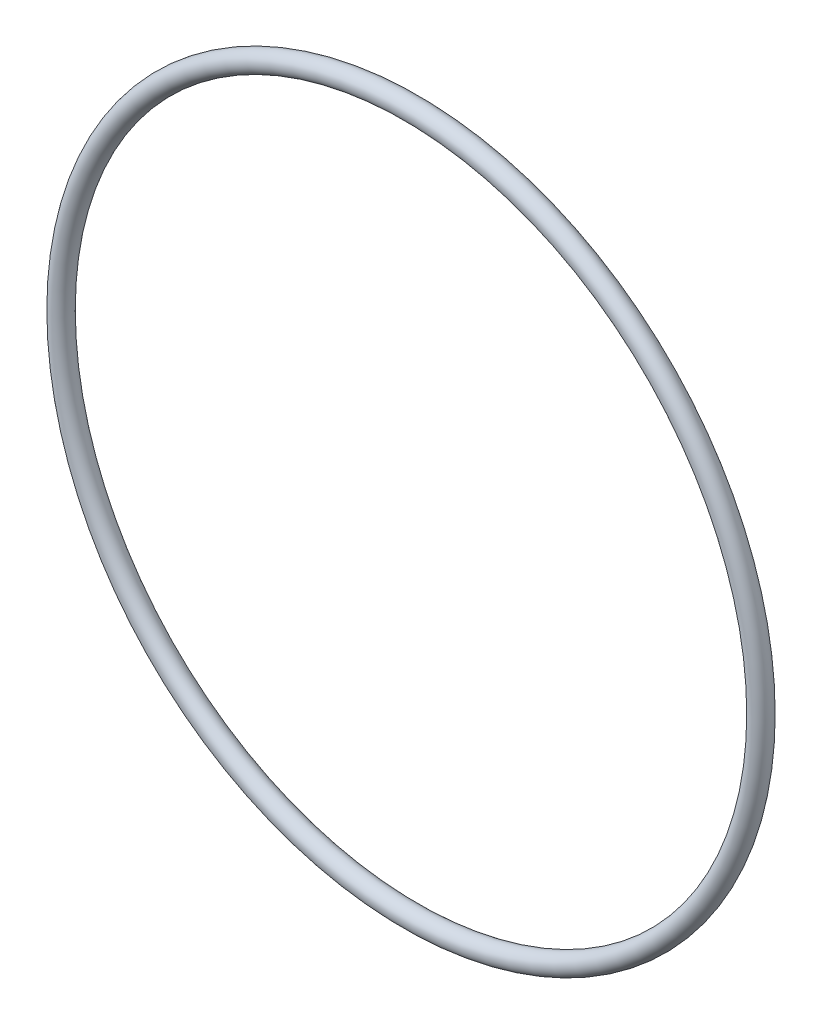
ISO-10303-21;
HEADER;
FILE_DESCRIPTION(('STEP AP214'),'2;1');
FILE_NAME('part.step','',(''),(''),'','','');
FILE_SCHEMA(('AUTOMOTIVE_DESIGN { 1 0 10303 214 1 1 1 1 }'));
ENDSEC;
DATA;
#1=APPLICATION_CONTEXT('core data for automotive mechanical design processes');
#2=APPLICATION_PROTOCOL_DEFINITION('international standard','automotive_design',2000,#1);
#3=PRODUCT_CONTEXT('',#1,'mechanical');
#4=PRODUCT('Part','Part','',(#3));
#5=PRODUCT_RELATED_PRODUCT_CATEGORY('part','',(#4));
#6=PRODUCT_DEFINITION_FORMATION('','',#4);
#7=PRODUCT_DEFINITION_CONTEXT('part definition',#1,'design');
#8=PRODUCT_DEFINITION('design','',#6,#7);
#9=PRODUCT_DEFINITION_SHAPE('','',#8);
#10=(LENGTH_UNIT() NAMED_UNIT(*) SI_UNIT(.MILLI.,.METRE.));
#11=(NAMED_UNIT(*) PLANE_ANGLE_UNIT() SI_UNIT($,.RADIAN.));
#12=(NAMED_UNIT(*) SI_UNIT($,.STERADIAN.) SOLID_ANGLE_UNIT());
#13=UNCERTAINTY_MEASURE_WITH_UNIT(LENGTH_MEASURE(1.E-05),#10,'distance_accuracy_value','');
#14=(GEOMETRIC_REPRESENTATION_CONTEXT(3) GLOBAL_UNCERTAINTY_ASSIGNED_CONTEXT((#13)) GLOBAL_UNIT_ASSIGNED_CONTEXT((#10,
#11,#12)) REPRESENTATION_CONTEXT('',''));
#15=CARTESIAN_POINT('',(0.,0.,0.));
#16=DIRECTION('',(0.,0.,1.));
#17=DIRECTION('',(1.,0.,0.));
#18=AXIS2_PLACEMENT_3D('',#15,#16,#17);
#19=CARTESIAN_POINT('',(0.,0.,0.));
#20=DIRECTION('',(0.,0.,1.));
#21=DIRECTION('',(1.,0.,0.));
#22=AXIS2_PLACEMENT_3D('',#19,#20,#21);
#23=TOROIDAL_SURFACE('',#22,30.9118,0.889);
#24=CARTESIAN_POINT('',(31.8008,0.,0.));
#25=VERTEX_POINT('',#24);
#26=VERTEX_LOOP('',#25);
#27=FACE_BOUND('',#26,.T.);
#28=ADVANCED_FACE('F27',(#27),#23,.T.);
#29=CLOSED_SHELL('',(#28));
#30=MANIFOLD_SOLID_BREP('B2',#29);
#31=ADVANCED_BREP_SHAPE_REPRESENTATION('',(#18,#30),#14);
#32=SHAPE_DEFINITION_REPRESENTATION(#9,#31);
ENDSEC;
END-ISO-10303-21;
